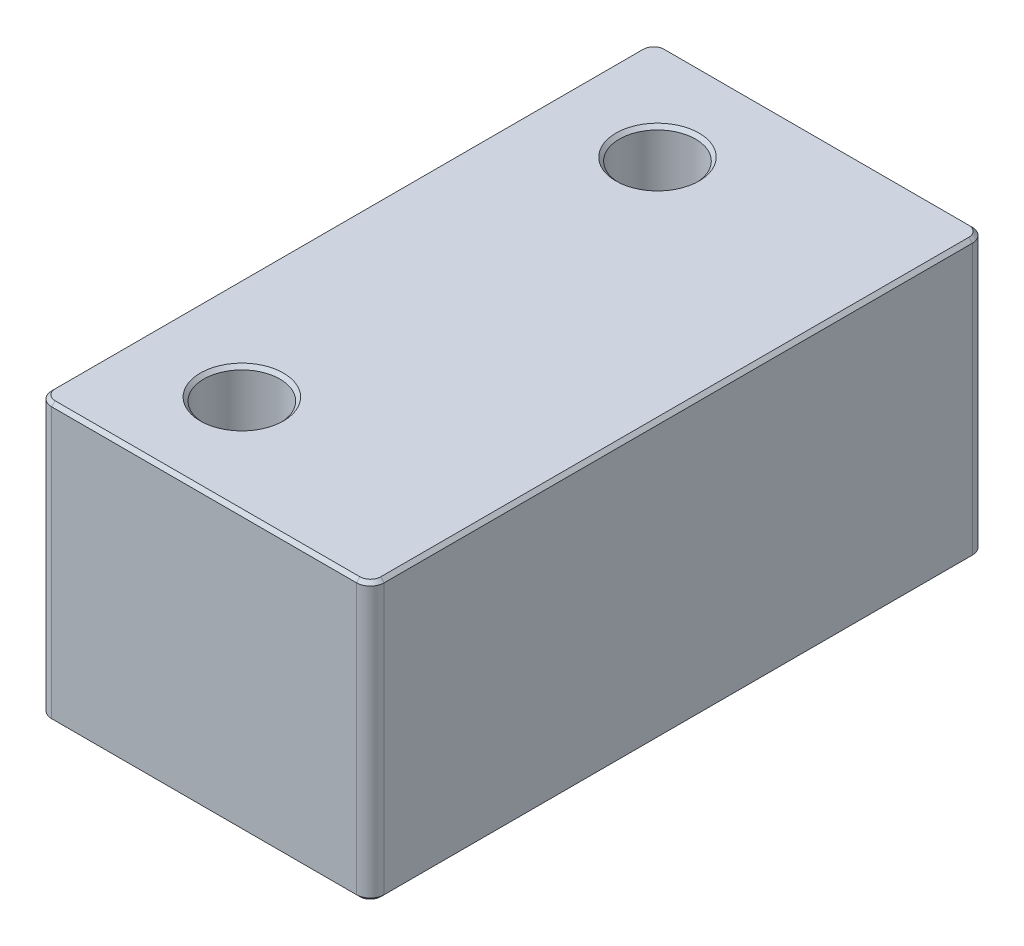
ISO-10303-21;
HEADER;
FILE_DESCRIPTION(('STEP AP214'),'2;1');
FILE_NAME('part.step','',(''),(''),'','','');
FILE_SCHEMA(('AUTOMOTIVE_DESIGN { 1 0 10303 214 1 1 1 1 }'));
ENDSEC;
DATA;
#1=APPLICATION_CONTEXT('core data for automotive mechanical design processes');
#2=APPLICATION_PROTOCOL_DEFINITION('international standard','automotive_design',2000,#1);
#3=PRODUCT_CONTEXT('',#1,'mechanical');
#4=PRODUCT('Part','Part','',(#3));
#5=PRODUCT_RELATED_PRODUCT_CATEGORY('part','',(#4));
#6=PRODUCT_DEFINITION_FORMATION('','',#4);
#7=PRODUCT_DEFINITION_CONTEXT('part definition',#1,'design');
#8=PRODUCT_DEFINITION('design','',#6,#7);
#9=PRODUCT_DEFINITION_SHAPE('','',#8);
#10=(LENGTH_UNIT() NAMED_UNIT(*) SI_UNIT(.MILLI.,.METRE.));
#11=(NAMED_UNIT(*) PLANE_ANGLE_UNIT() SI_UNIT($,.RADIAN.));
#12=(NAMED_UNIT(*) SI_UNIT($,.STERADIAN.) SOLID_ANGLE_UNIT());
#13=UNCERTAINTY_MEASURE_WITH_UNIT(LENGTH_MEASURE(1.E-05),#10,'distance_accuracy_value','');
#14=(GEOMETRIC_REPRESENTATION_CONTEXT(3) GLOBAL_UNCERTAINTY_ASSIGNED_CONTEXT((#13)) GLOBAL_UNIT_ASSIGNED_CONTEXT((#10,
#11,#12)) REPRESENTATION_CONTEXT('',''));
#15=CARTESIAN_POINT('',(0.,0.,0.));
#16=DIRECTION('',(0.,0.,1.));
#17=DIRECTION('',(1.,0.,0.));
#18=AXIS2_PLACEMENT_3D('',#15,#16,#17);
#19=CARTESIAN_POINT('',(-12.,20.,22.225));
#20=DIRECTION('',(1.,0.,0.));
#21=DIRECTION('',(0.,0.,-1.));
#22=AXIS2_PLACEMENT_3D('',#19,#20,#21);
#23=PLANE('',#22);
#24=DIRECTION('',(0.,-1.,0.));
#25=VECTOR('',#24,1.);
#26=CARTESIAN_POINT('',(-12.,20.,-21.225));
#27=LINE('',#26,#25);
#28=CARTESIAN_POINT('',(-12.,19.75,-21.225));
#29=VERTEX_POINT('',#28);
#30=CARTESIAN_POINT('',(-12.,0.25,-21.225));
#31=VERTEX_POINT('',#30);
#32=EDGE_CURVE('E307',#29,#31,#27,.T.);
#33=ORIENTED_EDGE('',*,*,#32,.T.);
#34=DIRECTION('',(0.,0.,1.));
#35=VECTOR('',#34,1.);
#36=CARTESIAN_POINT('',(-12.,0.25,22.225));
#37=LINE('',#36,#35);
#38=CARTESIAN_POINT('',(-12.,0.25,21.225));
#39=VERTEX_POINT('',#38);
#40=EDGE_CURVE('E215',#31,#39,#37,.T.);
#41=ORIENTED_EDGE('',*,*,#40,.T.);
#42=DIRECTION('',(0.,-1.,0.));
#43=VECTOR('',#42,1.);
#44=CARTESIAN_POINT('',(-12.,20.,21.225));
#45=LINE('',#44,#43);
#46=CARTESIAN_POINT('',(-12.,19.75,21.225));
#47=VERTEX_POINT('',#46);
#48=EDGE_CURVE('E264',#39,#47,#45,.F.);
#49=ORIENTED_EDGE('',*,*,#48,.T.);
#50=DIRECTION('',(0.,0.,-1.));
#51=VECTOR('',#50,1.);
#52=CARTESIAN_POINT('',(-12.,19.75,-21.225));
#53=LINE('',#52,#51);
#54=EDGE_CURVE('E213',#47,#29,#53,.T.);
#55=ORIENTED_EDGE('',*,*,#54,.T.);
#56=EDGE_LOOP('',(#33,#41,#49,#55));
#57=FACE_BOUND('',#56,.T.);
#58=ADVANCED_FACE('F39',(#57),#23,.F.);
#59=CARTESIAN_POINT('',(12.,20.,22.225));
#60=DIRECTION('',(0.,0.,-1.));
#61=DIRECTION('',(-1.,0.,0.));
#62=AXIS2_PLACEMENT_3D('',#59,#60,#61);
#63=PLANE('',#62);
#64=DIRECTION('',(0.,-1.,0.));
#65=VECTOR('',#64,1.);
#66=CARTESIAN_POINT('',(-11.,20.,22.225));
#67=LINE('',#66,#65);
#68=CARTESIAN_POINT('',(-11.,19.75,22.225));
#69=VERTEX_POINT('',#68);
#70=CARTESIAN_POINT('',(-11.,0.25,22.225));
#71=VERTEX_POINT('',#70);
#72=EDGE_CURVE('E303',#69,#71,#67,.T.);
#73=ORIENTED_EDGE('',*,*,#72,.T.);
#74=DIRECTION('',(1.,0.,0.));
#75=VECTOR('',#74,1.);
#76=CARTESIAN_POINT('',(12.,0.25,22.225));
#77=LINE('',#76,#75);
#78=CARTESIAN_POINT('',(11.,0.25,22.225));
#79=VERTEX_POINT('',#78);
#80=EDGE_CURVE('E190',#71,#79,#77,.T.);
#81=ORIENTED_EDGE('',*,*,#80,.T.);
#82=DIRECTION('',(0.,-1.,0.));
#83=VECTOR('',#82,1.);
#84=CARTESIAN_POINT('',(11.,20.,22.225));
#85=LINE('',#84,#83);
#86=CARTESIAN_POINT('',(11.,19.75,22.225));
#87=VERTEX_POINT('',#86);
#88=EDGE_CURVE('E324',#79,#87,#85,.F.);
#89=ORIENTED_EDGE('',*,*,#88,.T.);
#90=DIRECTION('',(-1.,0.,0.));
#91=VECTOR('',#90,1.);
#92=CARTESIAN_POINT('',(-11.,19.75,22.225));
#93=LINE('',#92,#91);
#94=EDGE_CURVE('E188',#87,#69,#93,.T.);
#95=ORIENTED_EDGE('',*,*,#94,.T.);
#96=EDGE_LOOP('',(#73,#81,#89,#95));
#97=FACE_BOUND('',#96,.T.);
#98=ADVANCED_FACE('F350',(#97),#63,.F.);
#99=CARTESIAN_POINT('',(12.,20.,22.225));
#100=DIRECTION('',(-1.,0.,0.));
#101=DIRECTION('',(0.,0.,1.));
#102=AXIS2_PLACEMENT_3D('',#99,#100,#101);
#103=PLANE('',#102);
#104=DIRECTION('',(0.,-1.,0.));
#105=VECTOR('',#104,1.);
#106=CARTESIAN_POINT('',(12.,20.,21.225));
#107=LINE('',#106,#105);
#108=CARTESIAN_POINT('',(12.,19.75,21.225));
#109=VERTEX_POINT('',#108);
#110=CARTESIAN_POINT('',(12.,0.25,21.225));
#111=VERTEX_POINT('',#110);
#112=EDGE_CURVE('E317',#109,#111,#107,.T.);
#113=ORIENTED_EDGE('',*,*,#112,.T.);
#114=DIRECTION('',(0.,0.,-1.));
#115=VECTOR('',#114,1.);
#116=CARTESIAN_POINT('',(12.,0.25,22.225));
#117=LINE('',#116,#115);
#118=CARTESIAN_POINT('',(12.,0.25,-21.225));
#119=VERTEX_POINT('',#118);
#120=EDGE_CURVE('E198',#111,#119,#117,.T.);
#121=ORIENTED_EDGE('',*,*,#120,.T.);
#122=DIRECTION('',(0.,-1.,0.));
#123=VECTOR('',#122,1.);
#124=CARTESIAN_POINT('',(12.,20.,-21.225));
#125=LINE('',#124,#123);
#126=CARTESIAN_POINT('',(12.,19.75,-21.225));
#127=VERTEX_POINT('',#126);
#128=EDGE_CURVE('E320',#119,#127,#125,.F.);
#129=ORIENTED_EDGE('',*,*,#128,.T.);
#130=DIRECTION('',(0.,0.,1.));
#131=VECTOR('',#130,1.);
#132=CARTESIAN_POINT('',(12.,19.75,21.225));
#133=LINE('',#132,#131);
#134=EDGE_CURVE('E196',#127,#109,#133,.T.);
#135=ORIENTED_EDGE('',*,*,#134,.T.);
#136=EDGE_LOOP('',(#113,#121,#129,#135));
#137=FACE_BOUND('',#136,.T.);
#138=ADVANCED_FACE('F395',(#137),#103,.F.);
#139=CARTESIAN_POINT('',(12.,20.,-22.225));
#140=DIRECTION('',(0.,0.,1.));
#141=DIRECTION('',(1.,0.,0.));
#142=AXIS2_PLACEMENT_3D('',#139,#140,#141);
#143=PLANE('',#142);
#144=DIRECTION('',(0.,-1.,0.));
#145=VECTOR('',#144,1.);
#146=CARTESIAN_POINT('',(11.,20.,-22.225));
#147=LINE('',#146,#145);
#148=CARTESIAN_POINT('',(11.,19.75,-22.225));
#149=VERTEX_POINT('',#148);
#150=CARTESIAN_POINT('',(11.,0.25,-22.225));
#151=VERTEX_POINT('',#150);
#152=EDGE_CURVE('E309',#149,#151,#147,.T.);
#153=ORIENTED_EDGE('',*,*,#152,.T.);
#154=DIRECTION('',(-1.,0.,0.));
#155=VECTOR('',#154,1.);
#156=CARTESIAN_POINT('',(12.,0.25,-22.225));
#157=LINE('',#156,#155);
#158=CARTESIAN_POINT('',(-11.,0.25,-22.225));
#159=VERTEX_POINT('',#158);
#160=EDGE_CURVE('E207',#151,#159,#157,.T.);
#161=ORIENTED_EDGE('',*,*,#160,.T.);
#162=DIRECTION('',(0.,-1.,0.));
#163=VECTOR('',#162,1.);
#164=CARTESIAN_POINT('',(-11.,20.,-22.225));
#165=LINE('',#164,#163);
#166=CARTESIAN_POINT('',(-11.,19.75,-22.225));
#167=VERTEX_POINT('',#166);
#168=EDGE_CURVE('E314',#159,#167,#165,.F.);
#169=ORIENTED_EDGE('',*,*,#168,.T.);
#170=DIRECTION('',(1.,0.,0.));
#171=VECTOR('',#170,1.);
#172=CARTESIAN_POINT('',(11.,19.75,-22.225));
#173=LINE('',#172,#171);
#174=EDGE_CURVE('E205',#167,#149,#173,.T.);
#175=ORIENTED_EDGE('',*,*,#174,.T.);
#176=EDGE_LOOP('',(#153,#161,#169,#175));
#177=FACE_BOUND('',#176,.T.);
#178=ADVANCED_FACE('F379',(#177),#143,.F.);
#179=CARTESIAN_POINT('',(0.,20.,0.));
#180=DIRECTION('',(0.,1.,0.));
#181=DIRECTION('',(0.,0.,1.));
#182=AXIS2_PLACEMENT_3D('',#179,#180,#181);
#183=PLANE('',#182);
#184=DIRECTION('',(0.,0.,-1.));
#185=VECTOR('',#184,1.);
#186=CARTESIAN_POINT('',(11.75,20.,-21.225));
#187=LINE('',#186,#185);
#188=CARTESIAN_POINT('',(11.75,20.,21.225));
#189=VERTEX_POINT('',#188);
#190=CARTESIAN_POINT('',(11.75,20.,-21.225));
#191=VERTEX_POINT('',#190);
#192=EDGE_CURVE('E49',#189,#191,#187,.T.);
#193=ORIENTED_EDGE('',*,*,#192,.T.);
#194=CARTESIAN_POINT('',(11.,20.,-21.225));
#195=DIRECTION('',(0.,1.,0.));
#196=DIRECTION('',(0.,0.,1.));
#197=AXIS2_PLACEMENT_3D('',#194,#195,#196);
#198=CIRCLE('',#197,0.750000000000001);
#199=CARTESIAN_POINT('',(11.,20.,-21.975));
#200=VERTEX_POINT('',#199);
#201=EDGE_CURVE('E11',#191,#200,#198,.T.);
#202=ORIENTED_EDGE('',*,*,#201,.T.);
#203=DIRECTION('',(-1.,0.,0.));
#204=VECTOR('',#203,1.);
#205=CARTESIAN_POINT('',(-11.,20.,-21.975));
#206=LINE('',#205,#204);
#207=CARTESIAN_POINT('',(-11.,20.,-21.975));
#208=VERTEX_POINT('',#207);
#209=EDGE_CURVE('E235',#200,#208,#206,.T.);
#210=ORIENTED_EDGE('',*,*,#209,.T.);
#211=CARTESIAN_POINT('',(-11.,20.,-21.225));
#212=DIRECTION('',(0.,1.,0.));
#213=DIRECTION('',(0.,0.,1.));
#214=AXIS2_PLACEMENT_3D('',#211,#212,#213);
#215=CIRCLE('',#214,0.750000000000001);
#216=CARTESIAN_POINT('',(-11.75,20.,-21.225));
#217=VERTEX_POINT('',#216);
#218=EDGE_CURVE('E237',#208,#217,#215,.T.);
#219=ORIENTED_EDGE('',*,*,#218,.T.);
#220=DIRECTION('',(0.,0.,1.));
#221=VECTOR('',#220,1.);
#222=CARTESIAN_POINT('',(-11.75,20.,21.225));
#223=LINE('',#222,#221);
#224=CARTESIAN_POINT('',(-11.75,20.,21.225));
#225=VERTEX_POINT('',#224);
#226=EDGE_CURVE('E239',#217,#225,#223,.T.);
#227=ORIENTED_EDGE('',*,*,#226,.T.);
#228=CARTESIAN_POINT('',(-11.,20.,21.225));
#229=DIRECTION('',(0.,1.,0.));
#230=DIRECTION('',(0.,0.,1.));
#231=AXIS2_PLACEMENT_3D('',#228,#229,#230);
#232=CIRCLE('',#231,0.750000000000001);
#233=CARTESIAN_POINT('',(-11.,20.,21.975));
#234=VERTEX_POINT('',#233);
#235=EDGE_CURVE('E241',#225,#234,#232,.T.);
#236=ORIENTED_EDGE('',*,*,#235,.T.);
#237=DIRECTION('',(1.,0.,0.));
#238=VECTOR('',#237,1.);
#239=CARTESIAN_POINT('',(11.,20.,21.975));
#240=LINE('',#239,#238);
#241=CARTESIAN_POINT('',(11.,20.,21.975));
#242=VERTEX_POINT('',#241);
#243=EDGE_CURVE('E243',#234,#242,#240,.T.);
#244=ORIENTED_EDGE('',*,*,#243,.T.);
#245=CARTESIAN_POINT('',(11.,20.,21.225));
#246=DIRECTION('',(0.,1.,0.));
#247=DIRECTION('',(0.,0.,1.));
#248=AXIS2_PLACEMENT_3D('',#245,#246,#247);
#249=CIRCLE('',#248,0.750000000000001);
#250=EDGE_CURVE('E60',#242,#189,#249,.T.);
#251=ORIENTED_EDGE('',*,*,#250,.T.);
#252=EDGE_LOOP('',(#193,#202,#210,#219,#227,#236,#244,#251));
#253=FACE_BOUND('',#252,.T.);
#254=CARTESIAN_POINT('',(-4.5,20.,15.));
#255=DIRECTION('',(0.,1.,0.));
#256=DIRECTION('',(0.,0.,1.));
#257=AXIS2_PLACEMENT_3D('',#254,#255,#256);
#258=CIRCLE('',#257,3.);
#259=CARTESIAN_POINT('',(-4.5,20.,18.));
#260=VERTEX_POINT('',#259);
#261=EDGE_CURVE('E232',#260,#260,#258,.F.);
#262=ORIENTED_EDGE('',*,*,#261,.T.);
#263=EDGE_LOOP('',(#262));
#264=FACE_BOUND('',#263,.T.);
#265=CARTESIAN_POINT('',(-4.5,20.,-15.));
#266=DIRECTION('',(0.,1.,0.));
#267=DIRECTION('',(0.,0.,1.));
#268=AXIS2_PLACEMENT_3D('',#265,#266,#267);
#269=CIRCLE('',#268,3.);
#270=CARTESIAN_POINT('',(-4.5,20.,-12.));
#271=VERTEX_POINT('',#270);
#272=EDGE_CURVE('E229',#271,#271,#269,.F.);
#273=ORIENTED_EDGE('',*,*,#272,.T.);
#274=EDGE_LOOP('',(#273));
#275=FACE_BOUND('',#274,.T.);
#276=ADVANCED_FACE('F366',(#253,#264,#275),#183,.T.);
#277=CARTESIAN_POINT('',(0.,0.,0.));
#278=DIRECTION('',(0.,1.,0.));
#279=DIRECTION('',(0.,0.,1.));
#280=AXIS2_PLACEMENT_3D('',#277,#278,#279);
#281=PLANE('',#280);
#282=DIRECTION('',(-1.,0.,0.));
#283=VECTOR('',#282,1.);
#284=CARTESIAN_POINT('',(0.,0.,21.975));
#285=LINE('',#284,#283);
#286=CARTESIAN_POINT('',(11.,0.,21.975));
#287=VERTEX_POINT('',#286);
#288=CARTESIAN_POINT('',(-11.,0.,21.975));
#289=VERTEX_POINT('',#288);
#290=EDGE_CURVE('E178',#287,#289,#285,.T.);
#291=ORIENTED_EDGE('',*,*,#290,.T.);
#292=CARTESIAN_POINT('',(-11.,0.,21.225));
#293=DIRECTION('',(0.,1.,0.));
#294=DIRECTION('',(0.,0.,1.));
#295=AXIS2_PLACEMENT_3D('',#292,#293,#294);
#296=CIRCLE('',#295,0.750000000000001);
#297=CARTESIAN_POINT('',(-11.75,0.,21.225));
#298=VERTEX_POINT('',#297);
#299=EDGE_CURVE('E158',#289,#298,#296,.F.);
#300=ORIENTED_EDGE('',*,*,#299,.T.);
#301=DIRECTION('',(0.,0.,-1.));
#302=VECTOR('',#301,1.);
#303=CARTESIAN_POINT('',(-11.75,0.,0.));
#304=LINE('',#303,#302);
#305=CARTESIAN_POINT('',(-11.75,0.,-21.225));
#306=VERTEX_POINT('',#305);
#307=EDGE_CURVE('E166',#298,#306,#304,.T.);
#308=ORIENTED_EDGE('',*,*,#307,.T.);
#309=CARTESIAN_POINT('',(-11.,0.,-21.225));
#310=DIRECTION('',(0.,1.,0.));
#311=DIRECTION('',(0.,0.,1.));
#312=AXIS2_PLACEMENT_3D('',#309,#310,#311);
#313=CIRCLE('',#312,0.750000000000001);
#314=CARTESIAN_POINT('',(-11.,0.,-21.975));
#315=VERTEX_POINT('',#314);
#316=EDGE_CURVE('E172',#306,#315,#313,.F.);
#317=ORIENTED_EDGE('',*,*,#316,.T.);
#318=DIRECTION('',(1.,0.,0.));
#319=VECTOR('',#318,1.);
#320=CARTESIAN_POINT('',(0.,0.,-21.975));
#321=LINE('',#320,#319);
#322=CARTESIAN_POINT('',(11.,0.,-21.975));
#323=VERTEX_POINT('',#322);
#324=EDGE_CURVE('E333',#315,#323,#321,.T.);
#325=ORIENTED_EDGE('',*,*,#324,.T.);
#326=CARTESIAN_POINT('',(11.,0.,-21.225));
#327=DIRECTION('',(0.,1.,0.));
#328=DIRECTION('',(0.,0.,1.));
#329=AXIS2_PLACEMENT_3D('',#326,#327,#328);
#330=CIRCLE('',#329,0.750000000000001);
#331=CARTESIAN_POINT('',(11.75,0.,-21.225));
#332=VERTEX_POINT('',#331);
#333=EDGE_CURVE('E335',#323,#332,#330,.F.);
#334=ORIENTED_EDGE('',*,*,#333,.T.);
#335=DIRECTION('',(0.,0.,1.));
#336=VECTOR('',#335,1.);
#337=CARTESIAN_POINT('',(11.75,0.,0.));
#338=LINE('',#337,#336);
#339=CARTESIAN_POINT('',(11.75,0.,21.225));
#340=VERTEX_POINT('',#339);
#341=EDGE_CURVE('E337',#332,#340,#338,.T.);
#342=ORIENTED_EDGE('',*,*,#341,.T.);
#343=CARTESIAN_POINT('',(11.,0.,21.225));
#344=DIRECTION('',(0.,1.,0.));
#345=DIRECTION('',(0.,0.,1.));
#346=AXIS2_PLACEMENT_3D('',#343,#344,#345);
#347=CIRCLE('',#346,0.750000000000001);
#348=EDGE_CURVE('E183',#340,#287,#347,.F.);
#349=ORIENTED_EDGE('',*,*,#348,.T.);
#350=EDGE_LOOP('',(#291,#300,#308,#317,#325,#334,#342,#349));
#351=FACE_BOUND('',#350,.T.);
#352=CARTESIAN_POINT('',(-4.5,0.,15.));
#353=DIRECTION('',(0.,1.,0.));
#354=DIRECTION('',(0.,0.,1.));
#355=AXIS2_PLACEMENT_3D('',#352,#353,#354);
#356=CIRCLE('',#355,3.);
#357=CARTESIAN_POINT('',(-4.5,0.,18.));
#358=VERTEX_POINT('',#357);
#359=EDGE_CURVE('E173',#358,#358,#356,.T.);
#360=ORIENTED_EDGE('',*,*,#359,.T.);
#361=EDGE_LOOP('',(#360));
#362=FACE_BOUND('',#361,.T.);
#363=CARTESIAN_POINT('',(-4.5,0.,-15.));
#364=DIRECTION('',(0.,1.,0.));
#365=DIRECTION('',(0.,0.,1.));
#366=AXIS2_PLACEMENT_3D('',#363,#364,#365);
#367=CIRCLE('',#366,3.);
#368=CARTESIAN_POINT('',(-4.5,0.,-12.));
#369=VERTEX_POINT('',#368);
#370=EDGE_CURVE('E327',#369,#369,#367,.T.);
#371=ORIENTED_EDGE('',*,*,#370,.T.);
#372=EDGE_LOOP('',(#371));
#373=FACE_BOUND('',#372,.T.);
#374=ADVANCED_FACE('F175',(#351,#362,#373),#281,.F.);
#375=CARTESIAN_POINT('',(-4.5,20.,15.));
#376=DIRECTION('',(0.,1.,0.));
#377=DIRECTION('',(0.,0.,1.));
#378=AXIS2_PLACEMENT_3D('',#375,#376,#377);
#379=CYLINDRICAL_SURFACE('',#378,2.75);
#380=CARTESIAN_POINT('',(-4.5,0.250000000000004,15.));
#381=DIRECTION('',(0.,1.,0.));
#382=DIRECTION('',(0.,0.,1.));
#383=AXIS2_PLACEMENT_3D('',#380,#381,#382);
#384=CIRCLE('',#383,2.75);
#385=CARTESIAN_POINT('',(-4.5,0.250000000000004,17.75));
#386=VERTEX_POINT('',#385);
#387=EDGE_CURVE('E220',#386,#386,#384,.F.);
#388=ORIENTED_EDGE('',*,*,#387,.T.);
#389=EDGE_LOOP('',(#388));
#390=FACE_BOUND('',#389,.T.);
#391=CARTESIAN_POINT('',(-4.5,19.75,15.));
#392=DIRECTION('',(0.,1.,0.));
#393=DIRECTION('',(0.,0.,1.));
#394=AXIS2_PLACEMENT_3D('',#391,#392,#393);
#395=CIRCLE('',#394,2.75);
#396=CARTESIAN_POINT('',(-4.5,19.75,17.75));
#397=VERTEX_POINT('',#396);
#398=EDGE_CURVE('E217',#397,#397,#395,.T.);
#399=ORIENTED_EDGE('',*,*,#398,.T.);
#400=EDGE_LOOP('',(#399));
#401=FACE_BOUND('',#400,.T.);
#402=ADVANCED_FACE('F532',(#390,#401),#379,.F.);
#403=CARTESIAN_POINT('',(-4.5,20.,-15.));
#404=DIRECTION('',(0.,1.,0.));
#405=DIRECTION('',(0.,0.,1.));
#406=AXIS2_PLACEMENT_3D('',#403,#404,#405);
#407=CYLINDRICAL_SURFACE('',#406,2.75);
#408=CARTESIAN_POINT('',(-4.5,0.249999999999993,-15.));
#409=DIRECTION('',(0.,1.,0.));
#410=DIRECTION('',(0.,0.,1.));
#411=AXIS2_PLACEMENT_3D('',#408,#409,#410);
#412=CIRCLE('',#411,2.75);
#413=CARTESIAN_POINT('',(-4.5,0.249999999999993,-12.25));
#414=VERTEX_POINT('',#413);
#415=EDGE_CURVE('E226',#414,#414,#412,.F.);
#416=ORIENTED_EDGE('',*,*,#415,.T.);
#417=EDGE_LOOP('',(#416));
#418=FACE_BOUND('',#417,.T.);
#419=CARTESIAN_POINT('',(-4.5,19.75,-15.));
#420=DIRECTION('',(0.,1.,0.));
#421=DIRECTION('',(0.,0.,1.));
#422=AXIS2_PLACEMENT_3D('',#419,#420,#421);
#423=CIRCLE('',#422,2.75);
#424=CARTESIAN_POINT('',(-4.5,19.75,-12.25));
#425=VERTEX_POINT('',#424);
#426=EDGE_CURVE('E223',#425,#425,#423,.T.);
#427=ORIENTED_EDGE('',*,*,#426,.T.);
#428=EDGE_LOOP('',(#427));
#429=FACE_BOUND('',#428,.T.);
#430=ADVANCED_FACE('F412',(#418,#429),#407,.F.);
#431=CARTESIAN_POINT('',(-11.,20.,-21.225));
#432=DIRECTION('',(0.,-1.,0.));
#433=DIRECTION('',(0.,0.,-1.));
#434=AXIS2_PLACEMENT_3D('',#431,#432,#433);
#435=CYLINDRICAL_SURFACE('',#434,1.);
#436=ORIENTED_EDGE('',*,*,#168,.F.);
#437=CARTESIAN_POINT('',(-11.,0.25,-21.225));
#438=DIRECTION('',(0.,1.,0.));
#439=DIRECTION('',(0.,0.,1.));
#440=AXIS2_PLACEMENT_3D('',#437,#438,#439);
#441=CIRCLE('',#440,1.);
#442=EDGE_CURVE('E211',#159,#31,#441,.T.);
#443=ORIENTED_EDGE('',*,*,#442,.T.);
#444=ORIENTED_EDGE('',*,*,#32,.F.);
#445=CARTESIAN_POINT('',(-11.,19.75,-21.225));
#446=DIRECTION('',(0.,1.,0.));
#447=DIRECTION('',(0.,0.,1.));
#448=AXIS2_PLACEMENT_3D('',#445,#446,#447);
#449=CIRCLE('',#448,1.);
#450=EDGE_CURVE('E209',#29,#167,#449,.F.);
#451=ORIENTED_EDGE('',*,*,#450,.T.);
#452=EDGE_LOOP('',(#436,#443,#444,#451));
#453=FACE_BOUND('',#452,.T.);
#454=ADVANCED_FACE('F409',(#453),#435,.T.);
#455=CARTESIAN_POINT('',(11.,20.,-21.225));
#456=DIRECTION('',(0.,-1.,0.));
#457=DIRECTION('',(0.,0.,-1.));
#458=AXIS2_PLACEMENT_3D('',#455,#456,#457);
#459=CYLINDRICAL_SURFACE('',#458,1.);
#460=ORIENTED_EDGE('',*,*,#128,.F.);
#461=CARTESIAN_POINT('',(11.,0.25,-21.225));
#462=DIRECTION('',(0.,1.,0.));
#463=DIRECTION('',(0.,0.,1.));
#464=AXIS2_PLACEMENT_3D('',#461,#462,#463);
#465=CIRCLE('',#464,1.);
#466=EDGE_CURVE('E203',#119,#151,#465,.T.);
#467=ORIENTED_EDGE('',*,*,#466,.T.);
#468=ORIENTED_EDGE('',*,*,#152,.F.);
#469=CARTESIAN_POINT('',(11.,19.75,-21.225));
#470=DIRECTION('',(0.,1.,0.));
#471=DIRECTION('',(0.,0.,1.));
#472=AXIS2_PLACEMENT_3D('',#469,#470,#471);
#473=CIRCLE('',#472,1.);
#474=EDGE_CURVE('E200',#149,#127,#473,.F.);
#475=ORIENTED_EDGE('',*,*,#474,.T.);
#476=EDGE_LOOP('',(#460,#467,#468,#475));
#477=FACE_BOUND('',#476,.T.);
#478=ADVANCED_FACE('F384',(#477),#459,.T.);
#479=CARTESIAN_POINT('',(11.,20.,21.225));
#480=DIRECTION('',(0.,-1.,0.));
#481=DIRECTION('',(0.,0.,-1.));
#482=AXIS2_PLACEMENT_3D('',#479,#480,#481);
#483=CYLINDRICAL_SURFACE('',#482,1.);
#484=ORIENTED_EDGE('',*,*,#88,.F.);
#485=CARTESIAN_POINT('',(11.,0.25,21.225));
#486=DIRECTION('',(0.,1.,0.));
#487=DIRECTION('',(0.,0.,1.));
#488=AXIS2_PLACEMENT_3D('',#485,#486,#487);
#489=CIRCLE('',#488,1.);
#490=EDGE_CURVE('E194',#79,#111,#489,.T.);
#491=ORIENTED_EDGE('',*,*,#490,.T.);
#492=ORIENTED_EDGE('',*,*,#112,.F.);
#493=CARTESIAN_POINT('',(11.,19.75,21.225));
#494=DIRECTION('',(0.,1.,0.));
#495=DIRECTION('',(0.,0.,1.));
#496=AXIS2_PLACEMENT_3D('',#493,#494,#495);
#497=CIRCLE('',#496,1.);
#498=EDGE_CURVE('E192',#109,#87,#497,.F.);
#499=ORIENTED_EDGE('',*,*,#498,.T.);
#500=EDGE_LOOP('',(#484,#491,#492,#499));
#501=FACE_BOUND('',#500,.T.);
#502=ADVANCED_FACE('F352',(#501),#483,.T.);
#503=CARTESIAN_POINT('',(-11.,20.,21.225));
#504=DIRECTION('',(0.,-1.,0.));
#505=DIRECTION('',(0.,0.,-1.));
#506=AXIS2_PLACEMENT_3D('',#503,#504,#505);
#507=CYLINDRICAL_SURFACE('',#506,1.);
#508=ORIENTED_EDGE('',*,*,#48,.F.);
#509=CARTESIAN_POINT('',(-11.,0.25,21.225));
#510=DIRECTION('',(0.,1.,0.));
#511=DIRECTION('',(0.,0.,1.));
#512=AXIS2_PLACEMENT_3D('',#509,#510,#511);
#513=CIRCLE('',#512,1.);
#514=EDGE_CURVE('E160',#39,#71,#513,.T.);
#515=ORIENTED_EDGE('',*,*,#514,.T.);
#516=ORIENTED_EDGE('',*,*,#72,.F.);
#517=CARTESIAN_POINT('',(-11.,19.75,21.225));
#518=DIRECTION('',(0.,1.,0.));
#519=DIRECTION('',(0.,0.,1.));
#520=AXIS2_PLACEMENT_3D('',#517,#518,#519);
#521=CIRCLE('',#520,1.);
#522=EDGE_CURVE('E180',#69,#47,#521,.F.);
#523=ORIENTED_EDGE('',*,*,#522,.T.);
#524=EDGE_LOOP('',(#508,#515,#516,#523));
#525=FACE_BOUND('',#524,.T.);
#526=ADVANCED_FACE('F301',(#525),#507,.T.);
#527=CARTESIAN_POINT('',(11.,0.,-21.225));
#528=DIRECTION('',(0.,1.,0.));
#529=DIRECTION('',(0.,0.,1.));
#530=AXIS2_PLACEMENT_3D('',#527,#528,#529);
#531=CONICAL_SURFACE('',#530,0.750000000000001,0.785398163397447);
#532=DIRECTION('',(0.,-0.707106781186547,0.707106781186547));
#533=VECTOR('',#532,1.);
#534=CARTESIAN_POINT('',(11.,0.25,-22.225));
#535=LINE('',#534,#533);
#536=EDGE_CURVE('E258',#151,#323,#535,.T.);
#537=ORIENTED_EDGE('',*,*,#536,.F.);
#538=ORIENTED_EDGE('',*,*,#466,.F.);
#539=DIRECTION('',(0.707106781186547,0.707106781186547,0.));
#540=VECTOR('',#539,1.);
#541=CARTESIAN_POINT('',(11.75,0.,-21.225));
#542=LINE('',#541,#540);
#543=EDGE_CURVE('E261',#332,#119,#542,.T.);
#544=ORIENTED_EDGE('',*,*,#543,.F.);
#545=ORIENTED_EDGE('',*,*,#333,.F.);
#546=EDGE_LOOP('',(#537,#538,#544,#545));
#547=FACE_BOUND('',#546,.T.);
#548=ADVANCED_FACE('F388',(#547),#531,.T.);
#549=CARTESIAN_POINT('',(12.,0.25,22.225));
#550=DIRECTION('',(-0.707106781186547,0.707106781186547,0.));
#551=DIRECTION('',(0.,0.,-1.));
#552=AXIS2_PLACEMENT_3D('',#549,#550,#551);
#553=PLANE('',#552);
#554=ORIENTED_EDGE('',*,*,#543,.T.);
#555=ORIENTED_EDGE('',*,*,#120,.F.);
#556=DIRECTION('',(0.707106781186547,0.707106781186547,0.));
#557=VECTOR('',#556,1.);
#558=CARTESIAN_POINT('',(11.75,0.,21.225));
#559=LINE('',#558,#557);
#560=EDGE_CURVE('E255',#340,#111,#559,.T.);
#561=ORIENTED_EDGE('',*,*,#560,.F.);
#562=ORIENTED_EDGE('',*,*,#341,.F.);
#563=EDGE_LOOP('',(#554,#555,#561,#562));
#564=FACE_BOUND('',#563,.T.);
#565=ADVANCED_FACE('F393',(#564),#553,.F.);
#566=CARTESIAN_POINT('',(12.,0.25,-22.225));
#567=DIRECTION('',(0.,0.70710678118655,0.707106781186545));
#568=DIRECTION('',(-1.,0.,0.));
#569=AXIS2_PLACEMENT_3D('',#566,#567,#568);
#570=PLANE('',#569);
#571=ORIENTED_EDGE('',*,*,#536,.T.);
#572=ORIENTED_EDGE('',*,*,#324,.F.);
#573=DIRECTION('',(0.,-0.707106781186542,0.707106781186552));
#574=VECTOR('',#573,1.);
#575=CARTESIAN_POINT('',(-11.,0.25,-22.225));
#576=LINE('',#575,#574);
#577=EDGE_CURVE('E252',#159,#315,#576,.T.);
#578=ORIENTED_EDGE('',*,*,#577,.F.);
#579=ORIENTED_EDGE('',*,*,#160,.F.);
#580=EDGE_LOOP('',(#571,#572,#578,#579));
#581=FACE_BOUND('',#580,.T.);
#582=ADVANCED_FACE('F450',(#581),#570,.F.);
#583=CARTESIAN_POINT('',(11.,0.,21.225));
#584=DIRECTION('',(0.,1.,0.));
#585=DIRECTION('',(0.,0.,1.));
#586=AXIS2_PLACEMENT_3D('',#583,#584,#585);
#587=CONICAL_SURFACE('',#586,0.750000000000001,0.785398163397447);
#588=ORIENTED_EDGE('',*,*,#560,.T.);
#589=ORIENTED_EDGE('',*,*,#490,.F.);
#590=DIRECTION('',(0.,0.707106781186547,0.707106781186547));
#591=VECTOR('',#590,1.);
#592=CARTESIAN_POINT('',(11.,0.,21.975));
#593=LINE('',#592,#591);
#594=EDGE_CURVE('E249',#287,#79,#593,.T.);
#595=ORIENTED_EDGE('',*,*,#594,.F.);
#596=ORIENTED_EDGE('',*,*,#348,.F.);
#597=EDGE_LOOP('',(#588,#589,#595,#596));
#598=FACE_BOUND('',#597,.T.);
#599=ADVANCED_FACE('F344',(#598),#587,.T.);
#600=CARTESIAN_POINT('',(-11.,0.,-21.225));
#601=DIRECTION('',(0.,1.,0.));
#602=DIRECTION('',(0.,0.,1.));
#603=AXIS2_PLACEMENT_3D('',#600,#601,#602);
#604=CONICAL_SURFACE('',#603,0.750000000000001,0.785398163397447);
#605=ORIENTED_EDGE('',*,*,#577,.T.);
#606=ORIENTED_EDGE('',*,*,#316,.F.);
#607=DIRECTION('',(0.707106781186547,-0.707106781186547,0.));
#608=VECTOR('',#607,1.);
#609=CARTESIAN_POINT('',(-12.,0.25,-21.225));
#610=LINE('',#609,#608);
#611=EDGE_CURVE('E169',#31,#306,#610,.T.);
#612=ORIENTED_EDGE('',*,*,#611,.F.);
#613=ORIENTED_EDGE('',*,*,#442,.F.);
#614=EDGE_LOOP('',(#605,#606,#612,#613));
#615=FACE_BOUND('',#614,.T.);
#616=ADVANCED_FACE('F438',(#615),#604,.T.);
#617=CARTESIAN_POINT('',(12.,0.25,22.225));
#618=DIRECTION('',(0.,0.707106781186547,-0.707106781186547));
#619=DIRECTION('',(1.,0.,0.));
#620=AXIS2_PLACEMENT_3D('',#617,#618,#619);
#621=PLANE('',#620);
#622=ORIENTED_EDGE('',*,*,#594,.T.);
#623=ORIENTED_EDGE('',*,*,#80,.F.);
#624=DIRECTION('',(0.,0.707106781186547,0.707106781186548));
#625=VECTOR('',#624,1.);
#626=CARTESIAN_POINT('',(-11.,0.,21.975));
#627=LINE('',#626,#625);
#628=EDGE_CURVE('E163',#289,#71,#627,.T.);
#629=ORIENTED_EDGE('',*,*,#628,.F.);
#630=ORIENTED_EDGE('',*,*,#290,.F.);
#631=EDGE_LOOP('',(#622,#623,#629,#630));
#632=FACE_BOUND('',#631,.T.);
#633=ADVANCED_FACE('F347',(#632),#621,.F.);
#634=CARTESIAN_POINT('',(-12.,0.25,22.225));
#635=DIRECTION('',(0.707106781186547,0.707106781186547,0.));
#636=DIRECTION('',(0.,0.,1.));
#637=AXIS2_PLACEMENT_3D('',#634,#635,#636);
#638=PLANE('',#637);
#639=ORIENTED_EDGE('',*,*,#611,.T.);
#640=ORIENTED_EDGE('',*,*,#307,.F.);
#641=DIRECTION('',(0.707106781186547,-0.707106781186547,0.));
#642=VECTOR('',#641,1.);
#643=CARTESIAN_POINT('',(-12.,0.25,21.225));
#644=LINE('',#643,#642);
#645=EDGE_CURVE('E154',#39,#298,#644,.T.);
#646=ORIENTED_EDGE('',*,*,#645,.F.);
#647=ORIENTED_EDGE('',*,*,#40,.F.);
#648=EDGE_LOOP('',(#639,#640,#646,#647));
#649=FACE_BOUND('',#648,.T.);
#650=ADVANCED_FACE('F167',(#649),#638,.F.);
#651=CARTESIAN_POINT('',(-11.,0.,21.225));
#652=DIRECTION('',(0.,1.,0.));
#653=DIRECTION('',(0.,0.,1.));
#654=AXIS2_PLACEMENT_3D('',#651,#652,#653);
#655=CONICAL_SURFACE('',#654,0.750000000000001,0.785398163397447);
#656=ORIENTED_EDGE('',*,*,#628,.T.);
#657=ORIENTED_EDGE('',*,*,#514,.F.);
#658=ORIENTED_EDGE('',*,*,#645,.T.);
#659=ORIENTED_EDGE('',*,*,#299,.F.);
#660=EDGE_LOOP('',(#656,#657,#658,#659));
#661=FACE_BOUND('',#660,.T.);
#662=ADVANCED_FACE('F156',(#661),#655,.T.);
#663=CARTESIAN_POINT('',(-4.5,0.,15.));
#664=DIRECTION('',(0.,-1.,0.));
#665=DIRECTION('',(0.,0.,-1.));
#666=AXIS2_PLACEMENT_3D('',#663,#664,#665);
#667=CONICAL_SURFACE('',#666,3.,0.785398163397436);
#668=ORIENTED_EDGE('',*,*,#387,.F.);
#669=EDGE_LOOP('',(#668));
#670=FACE_BOUND('',#669,.T.);
#671=ORIENTED_EDGE('',*,*,#359,.F.);
#672=EDGE_LOOP('',(#671));
#673=FACE_BOUND('',#672,.T.);
#674=ADVANCED_FACE('F427',(#670,#673),#667,.F.);
#675=CARTESIAN_POINT('',(-4.5,0.,-15.));
#676=DIRECTION('',(0.,-1.,0.));
#677=DIRECTION('',(0.,0.,-1.));
#678=AXIS2_PLACEMENT_3D('',#675,#676,#677);
#679=CONICAL_SURFACE('',#678,3.,0.785398163397457);
#680=ORIENTED_EDGE('',*,*,#415,.F.);
#681=EDGE_LOOP('',(#680));
#682=FACE_BOUND('',#681,.T.);
#683=ORIENTED_EDGE('',*,*,#370,.F.);
#684=EDGE_LOOP('',(#683));
#685=FACE_BOUND('',#684,.T.);
#686=ADVANCED_FACE('F471',(#682,#685),#679,.F.);
#687=CARTESIAN_POINT('',(-11.,20.,21.225));
#688=DIRECTION('',(0.,-1.,0.));
#689=DIRECTION('',(0.,0.,-1.));
#690=AXIS2_PLACEMENT_3D('',#687,#688,#689);
#691=CONICAL_SURFACE('',#690,0.750000000000001,0.785398163397447);
#692=DIRECTION('',(0.707106781186547,0.707106781186547,0.));
#693=VECTOR('',#692,1.);
#694=CARTESIAN_POINT('',(-12.,19.75,21.225));
#695=LINE('',#694,#693);
#696=EDGE_CURVE('E280',#47,#225,#695,.T.);
#697=ORIENTED_EDGE('',*,*,#696,.F.);
#698=ORIENTED_EDGE('',*,*,#522,.F.);
#699=DIRECTION('',(0.,-0.707106781186547,0.707106781186547));
#700=VECTOR('',#699,1.);
#701=CARTESIAN_POINT('',(-11.,20.,21.975));
#702=LINE('',#701,#700);
#703=EDGE_CURVE('E44',#234,#69,#702,.T.);
#704=ORIENTED_EDGE('',*,*,#703,.F.);
#705=ORIENTED_EDGE('',*,*,#235,.F.);
#706=EDGE_LOOP('',(#697,#698,#704,#705));
#707=FACE_BOUND('',#706,.T.);
#708=ADVANCED_FACE('F296',(#707),#691,.T.);
#709=CARTESIAN_POINT('',(0.,20.,21.975));
#710=DIRECTION('',(0.,0.707106781186547,0.707106781186547));
#711=DIRECTION('',(-1.,0.,0.));
#712=AXIS2_PLACEMENT_3D('',#709,#710,#711);
#713=PLANE('',#712);
#714=ORIENTED_EDGE('',*,*,#703,.T.);
#715=ORIENTED_EDGE('',*,*,#94,.F.);
#716=DIRECTION('',(0.,-0.707106781186547,0.707106781186547));
#717=VECTOR('',#716,1.);
#718=CARTESIAN_POINT('',(11.,20.,21.975));
#719=LINE('',#718,#717);
#720=EDGE_CURVE('E278',#242,#87,#719,.T.);
#721=ORIENTED_EDGE('',*,*,#720,.F.);
#722=ORIENTED_EDGE('',*,*,#243,.F.);
#723=EDGE_LOOP('',(#714,#715,#721,#722));
#724=FACE_BOUND('',#723,.T.);
#725=ADVANCED_FACE('F291',(#724),#713,.T.);
#726=CARTESIAN_POINT('',(-11.75,20.,0.));
#727=DIRECTION('',(-0.707106781186547,0.707106781186547,0.));
#728=DIRECTION('',(0.,0.,-1.));
#729=AXIS2_PLACEMENT_3D('',#726,#727,#728);
#730=PLANE('',#729);
#731=ORIENTED_EDGE('',*,*,#696,.T.);
#732=ORIENTED_EDGE('',*,*,#226,.F.);
#733=DIRECTION('',(0.707106781186547,0.707106781186547,0.));
#734=VECTOR('',#733,1.);
#735=CARTESIAN_POINT('',(-12.,19.75,-21.225));
#736=LINE('',#735,#734);
#737=EDGE_CURVE('E275',#29,#217,#736,.T.);
#738=ORIENTED_EDGE('',*,*,#737,.F.);
#739=ORIENTED_EDGE('',*,*,#54,.F.);
#740=EDGE_LOOP('',(#731,#732,#738,#739));
#741=FACE_BOUND('',#740,.T.);
#742=ADVANCED_FACE('F507',(#741),#730,.T.);
#743=CARTESIAN_POINT('',(11.,20.,21.225));
#744=DIRECTION('',(0.,-1.,0.));
#745=DIRECTION('',(0.,0.,-1.));
#746=AXIS2_PLACEMENT_3D('',#743,#744,#745);
#747=CONICAL_SURFACE('',#746,0.750000000000001,0.785398163397447);
#748=ORIENTED_EDGE('',*,*,#720,.T.);
#749=ORIENTED_EDGE('',*,*,#498,.F.);
#750=DIRECTION('',(0.707106781186547,-0.707106781186547,0.));
#751=VECTOR('',#750,1.);
#752=CARTESIAN_POINT('',(11.75,20.,21.225));
#753=LINE('',#752,#751);
#754=EDGE_CURVE('E272',#189,#109,#753,.T.);
#755=ORIENTED_EDGE('',*,*,#754,.F.);
#756=ORIENTED_EDGE('',*,*,#250,.F.);
#757=EDGE_LOOP('',(#748,#749,#755,#756));
#758=FACE_BOUND('',#757,.T.);
#759=ADVANCED_FACE('F356',(#758),#747,.T.);
#760=CARTESIAN_POINT('',(-11.,20.,-21.225));
#761=DIRECTION('',(0.,-1.,0.));
#762=DIRECTION('',(0.,0.,-1.));
#763=AXIS2_PLACEMENT_3D('',#760,#761,#762);
#764=CONICAL_SURFACE('',#763,0.750000000000001,0.785398163397447);
#765=ORIENTED_EDGE('',*,*,#737,.T.);
#766=ORIENTED_EDGE('',*,*,#218,.F.);
#767=DIRECTION('',(0.,0.707106781186547,0.707106781186547));
#768=VECTOR('',#767,1.);
#769=CARTESIAN_POINT('',(-11.,19.75,-22.225));
#770=LINE('',#769,#768);
#771=EDGE_CURVE('E269',#167,#208,#770,.T.);
#772=ORIENTED_EDGE('',*,*,#771,.F.);
#773=ORIENTED_EDGE('',*,*,#450,.F.);
#774=EDGE_LOOP('',(#765,#766,#772,#773));
#775=FACE_BOUND('',#774,.T.);
#776=ADVANCED_FACE('F372',(#775),#764,.T.);
#777=CARTESIAN_POINT('',(11.75,20.,0.));
#778=DIRECTION('',(0.707106781186547,0.707106781186547,0.));
#779=DIRECTION('',(0.,0.,1.));
#780=AXIS2_PLACEMENT_3D('',#777,#778,#779);
#781=PLANE('',#780);
#782=ORIENTED_EDGE('',*,*,#754,.T.);
#783=ORIENTED_EDGE('',*,*,#134,.F.);
#784=DIRECTION('',(0.707106781186547,-0.707106781186547,0.));
#785=VECTOR('',#784,1.);
#786=CARTESIAN_POINT('',(11.75,20.,-21.225));
#787=LINE('',#786,#785);
#788=EDGE_CURVE('E267',#191,#127,#787,.T.);
#789=ORIENTED_EDGE('',*,*,#788,.F.);
#790=ORIENTED_EDGE('',*,*,#192,.F.);
#791=EDGE_LOOP('',(#782,#783,#789,#790));
#792=FACE_BOUND('',#791,.T.);
#793=ADVANCED_FACE('F359',(#792),#781,.T.);
#794=CARTESIAN_POINT('',(0.,20.,-21.975));
#795=DIRECTION('',(0.,0.70710678118655,-0.707106781186545));
#796=DIRECTION('',(1.,0.,0.));
#797=AXIS2_PLACEMENT_3D('',#794,#795,#796);
#798=PLANE('',#797);
#799=ORIENTED_EDGE('',*,*,#771,.T.);
#800=ORIENTED_EDGE('',*,*,#209,.F.);
#801=DIRECTION('',(0.,0.707106781186547,0.707106781186547));
#802=VECTOR('',#801,1.);
#803=CARTESIAN_POINT('',(11.,19.75,-22.225));
#804=LINE('',#803,#802);
#805=EDGE_CURVE('E265',#149,#200,#804,.T.);
#806=ORIENTED_EDGE('',*,*,#805,.F.);
#807=ORIENTED_EDGE('',*,*,#174,.F.);
#808=EDGE_LOOP('',(#799,#800,#806,#807));
#809=FACE_BOUND('',#808,.T.);
#810=ADVANCED_FACE('F376',(#809),#798,.T.);
#811=CARTESIAN_POINT('',(11.,20.,-21.225));
#812=DIRECTION('',(0.,-1.,0.));
#813=DIRECTION('',(0.,0.,-1.));
#814=AXIS2_PLACEMENT_3D('',#811,#812,#813);
#815=CONICAL_SURFACE('',#814,0.750000000000001,0.785398163397447);
#816=ORIENTED_EDGE('',*,*,#788,.T.);
#817=ORIENTED_EDGE('',*,*,#474,.F.);
#818=ORIENTED_EDGE('',*,*,#805,.T.);
#819=ORIENTED_EDGE('',*,*,#201,.F.);
#820=EDGE_LOOP('',(#816,#817,#818,#819));
#821=FACE_BOUND('',#820,.T.);
#822=ADVANCED_FACE('F363',(#821),#815,.T.);
#823=CARTESIAN_POINT('',(-4.5,19.75,15.));
#824=DIRECTION('',(0.,1.,0.));
#825=DIRECTION('',(0.,0.,1.));
#826=AXIS2_PLACEMENT_3D('',#823,#824,#825);
#827=CONICAL_SURFACE('',#826,2.75,0.785398163397443);
#828=ORIENTED_EDGE('',*,*,#261,.F.);
#829=EDGE_LOOP('',(#828));
#830=FACE_BOUND('',#829,.T.);
#831=ORIENTED_EDGE('',*,*,#398,.F.);
#832=EDGE_LOOP('',(#831));
#833=FACE_BOUND('',#832,.T.);
#834=ADVANCED_FACE('F486',(#830,#833),#827,.F.);
#835=CARTESIAN_POINT('',(-4.5,19.75,-15.));
#836=DIRECTION('',(0.,1.,0.));
#837=DIRECTION('',(0.,0.,1.));
#838=AXIS2_PLACEMENT_3D('',#835,#836,#837);
#839=CONICAL_SURFACE('',#838,2.75,0.785398163397443);
#840=ORIENTED_EDGE('',*,*,#272,.F.);
#841=EDGE_LOOP('',(#840));
#842=FACE_BOUND('',#841,.T.);
#843=ORIENTED_EDGE('',*,*,#426,.F.);
#844=EDGE_LOOP('',(#843));
#845=FACE_BOUND('',#844,.T.);
#846=ADVANCED_FACE('F42',(#842,#845),#839,.F.);
#847=CLOSED_SHELL('',(#58,#98,#138,#178,#276,#374,#402,#430,#454,#478,#502,#526,#548,#565,#582,
#599,#616,#633,#650,#662,#674,#686,#708,#725,#742,#759,#776,#793,#810,#822,#834,#846));
#848=MANIFOLD_SOLID_BREP('B2',#847);
#849=ADVANCED_BREP_SHAPE_REPRESENTATION('',(#18,#848),#14);
#850=SHAPE_DEFINITION_REPRESENTATION(#9,#849);
ENDSEC;
END-ISO-10303-21;
